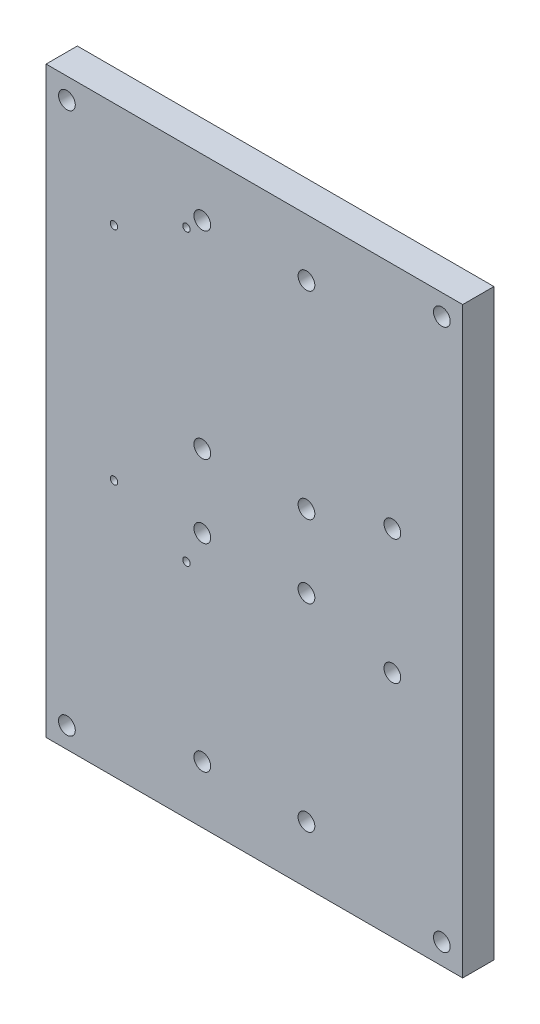
ISO-10303-21;
HEADER;
FILE_DESCRIPTION(('STEP AP214'),'2;1');
FILE_NAME('part.step','',(''),(''),'','','');
FILE_SCHEMA(('AUTOMOTIVE_DESIGN { 1 0 10303 214 1 1 1 1 }'));
ENDSEC;
DATA;
#1=APPLICATION_CONTEXT('core data for automotive mechanical design processes');
#2=APPLICATION_PROTOCOL_DEFINITION('international standard','automotive_design',2000,#1);
#3=PRODUCT_CONTEXT('',#1,'mechanical');
#4=PRODUCT('Part','Part','',(#3));
#5=PRODUCT_RELATED_PRODUCT_CATEGORY('part','',(#4));
#6=PRODUCT_DEFINITION_FORMATION('','',#4);
#7=PRODUCT_DEFINITION_CONTEXT('part definition',#1,'design');
#8=PRODUCT_DEFINITION('design','',#6,#7);
#9=PRODUCT_DEFINITION_SHAPE('','',#8);
#10=(LENGTH_UNIT() NAMED_UNIT(*) SI_UNIT(.MILLI.,.METRE.));
#11=(NAMED_UNIT(*) PLANE_ANGLE_UNIT() SI_UNIT($,.RADIAN.));
#12=(NAMED_UNIT(*) SI_UNIT($,.STERADIAN.) SOLID_ANGLE_UNIT());
#13=UNCERTAINTY_MEASURE_WITH_UNIT(LENGTH_MEASURE(1.E-05),#10,'distance_accuracy_value','');
#14=(GEOMETRIC_REPRESENTATION_CONTEXT(3) GLOBAL_UNCERTAINTY_ASSIGNED_CONTEXT((#13)) GLOBAL_UNIT_ASSIGNED_CONTEXT((#10,
#11,#12)) REPRESENTATION_CONTEXT('',''));
#15=CARTESIAN_POINT('',(0.,0.,0.));
#16=DIRECTION('',(0.,0.,1.));
#17=DIRECTION('',(1.,0.,0.));
#18=AXIS2_PLACEMENT_3D('',#15,#16,#17);
#19=CARTESIAN_POINT('',(0.,0.,4.7625));
#20=DIRECTION('',(0.,0.,1.));
#21=DIRECTION('',(1.,0.,0.));
#22=AXIS2_PLACEMENT_3D('',#19,#20,#21);
#23=PLANE('',#22);
#24=CARTESIAN_POINT('',(-20.701,67.1195,4.7625));
#25=DIRECTION('',(0.,0.,1.));
#26=DIRECTION('',(1.,0.,0.));
#27=AXIS2_PLACEMENT_3D('',#24,#25,#26);
#28=CIRCLE('',#27,1.13029999999999);
#29=CARTESIAN_POINT('',(-19.5707,67.1195,4.7625));
#30=VERTEX_POINT('',#29);
#31=EDGE_CURVE('E228',#30,#30,#28,.T.);
#32=ORIENTED_EDGE('',*,*,#31,.F.);
#33=EDGE_LOOP('',(#32));
#34=FACE_BOUND('',#33,.T.);
#35=CARTESIAN_POINT('',(-42.799,56.7055,4.7625));
#36=DIRECTION('',(0.,0.,1.));
#37=DIRECTION('',(1.,0.,0.));
#38=AXIS2_PLACEMENT_3D('',#35,#36,#37);
#39=CIRCLE('',#38,1.13029999999999);
#40=CARTESIAN_POINT('',(-41.6687,56.7055,4.7625));
#41=VERTEX_POINT('',#40);
#42=EDGE_CURVE('E222',#41,#41,#39,.T.);
#43=ORIENTED_EDGE('',*,*,#42,.F.);
#44=EDGE_LOOP('',(#43));
#45=FACE_BOUND('',#44,.T.);
#46=CARTESIAN_POINT('',(-20.701,-21.082,4.7625));
#47=DIRECTION('',(0.,0.,1.));
#48=DIRECTION('',(1.,0.,0.));
#49=AXIS2_PLACEMENT_3D('',#46,#47,#48);
#50=CIRCLE('',#49,1.13029999999999);
#51=CARTESIAN_POINT('',(-19.5707,-21.082,4.7625));
#52=VERTEX_POINT('',#51);
#53=EDGE_CURVE('E216',#52,#52,#50,.T.);
#54=ORIENTED_EDGE('',*,*,#53,.F.);
#55=EDGE_LOOP('',(#54));
#56=FACE_BOUND('',#55,.T.);
#57=CARTESIAN_POINT('',(-42.799,-10.668,4.7625));
#58=DIRECTION('',(0.,0.,1.));
#59=DIRECTION('',(1.,0.,0.));
#60=AXIS2_PLACEMENT_3D('',#57,#58,#59);
#61=CIRCLE('',#60,1.13029999999999);
#62=CARTESIAN_POINT('',(-41.6687,-10.668,4.7625));
#63=VERTEX_POINT('',#62);
#64=EDGE_CURVE('E210',#63,#63,#61,.T.);
#65=ORIENTED_EDGE('',*,*,#64,.F.);
#66=EDGE_LOOP('',(#65));
#67=FACE_BOUND('',#66,.T.);
#68=CARTESIAN_POINT('',(42.06875,19.05,4.7625));
#69=DIRECTION('',(0.,0.,1.));
#70=DIRECTION('',(1.,0.,0.));
#71=AXIS2_PLACEMENT_3D('',#68,#69,#70);
#72=CIRCLE('',#71,2.55269999999999);
#73=CARTESIAN_POINT('',(44.62145,19.05,4.7625));
#74=VERTEX_POINT('',#73);
#75=EDGE_CURVE('E201',#74,#74,#72,.F.);
#76=ORIENTED_EDGE('',*,*,#75,.T.);
#77=EDGE_LOOP('',(#76));
#78=FACE_BOUND('',#77,.T.);
#79=CARTESIAN_POINT('',(42.06875,-19.05,4.7625));
#80=DIRECTION('',(0.,0.,1.));
#81=DIRECTION('',(1.,0.,0.));
#82=AXIS2_PLACEMENT_3D('',#79,#80,#81);
#83=CIRCLE('',#82,2.55269999999999);
#84=CARTESIAN_POINT('',(44.62145,-19.05,4.7625));
#85=VERTEX_POINT('',#84);
#86=EDGE_CURVE('E195',#85,#85,#83,.F.);
#87=ORIENTED_EDGE('',*,*,#86,.T.);
#88=EDGE_LOOP('',(#87));
#89=FACE_BOUND('',#88,.T.);
#90=CARTESIAN_POINT('',(15.875,71.4375,4.7625));
#91=DIRECTION('',(0.,0.,1.));
#92=DIRECTION('',(1.,0.,0.));
#93=AXIS2_PLACEMENT_3D('',#90,#91,#92);
#94=CIRCLE('',#93,2.5527);
#95=CARTESIAN_POINT('',(18.4277,71.4375,4.7625));
#96=VERTEX_POINT('',#95);
#97=EDGE_CURVE('E189',#96,#96,#94,.F.);
#98=ORIENTED_EDGE('',*,*,#97,.T.);
#99=EDGE_LOOP('',(#98));
#100=FACE_BOUND('',#99,.T.);
#101=CARTESIAN_POINT('',(15.875,11.1125,4.7625));
#102=DIRECTION('',(0.,0.,1.));
#103=DIRECTION('',(1.,0.,0.));
#104=AXIS2_PLACEMENT_3D('',#101,#102,#103);
#105=CIRCLE('',#104,2.5527);
#106=CARTESIAN_POINT('',(18.4277,11.1125,4.7625));
#107=VERTEX_POINT('',#106);
#108=EDGE_CURVE('E177',#107,#107,#105,.F.);
#109=ORIENTED_EDGE('',*,*,#108,.T.);
#110=EDGE_LOOP('',(#109));
#111=FACE_BOUND('',#110,.T.);
#112=CARTESIAN_POINT('',(-15.875,71.4375,4.7625));
#113=DIRECTION('',(0.,0.,1.));
#114=DIRECTION('',(1.,0.,0.));
#115=AXIS2_PLACEMENT_3D('',#112,#113,#114);
#116=CIRCLE('',#115,2.5527);
#117=CARTESIAN_POINT('',(-13.3223,71.4375,4.7625));
#118=VERTEX_POINT('',#117);
#119=EDGE_CURVE('E171',#118,#118,#116,.F.);
#120=ORIENTED_EDGE('',*,*,#119,.T.);
#121=EDGE_LOOP('',(#120));
#122=FACE_BOUND('',#121,.T.);
#123=CARTESIAN_POINT('',(15.875,-11.1125,4.7625));
#124=DIRECTION('',(0.,0.,1.));
#125=DIRECTION('',(1.,0.,0.));
#126=AXIS2_PLACEMENT_3D('',#123,#124,#125);
#127=CIRCLE('',#126,2.5527);
#128=CARTESIAN_POINT('',(18.4277,-11.1125,4.7625));
#129=VERTEX_POINT('',#128);
#130=EDGE_CURVE('E165',#129,#129,#127,.F.);
#131=ORIENTED_EDGE('',*,*,#130,.T.);
#132=EDGE_LOOP('',(#131));
#133=FACE_BOUND('',#132,.T.);
#134=CARTESIAN_POINT('',(-15.875,-71.4375,4.7625));
#135=DIRECTION('',(0.,0.,1.));
#136=DIRECTION('',(1.,0.,0.));
#137=AXIS2_PLACEMENT_3D('',#134,#135,#136);
#138=CIRCLE('',#137,2.5527);
#139=CARTESIAN_POINT('',(-13.3223,-71.4375,4.7625));
#140=VERTEX_POINT('',#139);
#141=EDGE_CURVE('E159',#140,#140,#138,.F.);
#142=ORIENTED_EDGE('',*,*,#141,.T.);
#143=EDGE_LOOP('',(#142));
#144=FACE_BOUND('',#143,.T.);
#145=CARTESIAN_POINT('',(15.875,-71.4375,4.7625));
#146=DIRECTION('',(0.,0.,1.));
#147=DIRECTION('',(1.,0.,0.));
#148=AXIS2_PLACEMENT_3D('',#145,#146,#147);
#149=CIRCLE('',#148,2.5527);
#150=CARTESIAN_POINT('',(18.4277,-71.4375,4.7625));
#151=VERTEX_POINT('',#150);
#152=EDGE_CURVE('E153',#151,#151,#149,.F.);
#153=ORIENTED_EDGE('',*,*,#152,.T.);
#154=EDGE_LOOP('',(#153));
#155=FACE_BOUND('',#154,.T.);
#156=DIRECTION('',(0.,-1.,0.));
#157=VECTOR('',#156,1.);
#158=CARTESIAN_POINT('',(-63.5,88.9,4.7625));
#159=LINE('',#158,#157);
#160=CARTESIAN_POINT('',(-63.5,88.9,4.7625));
#161=VERTEX_POINT('',#160);
#162=CARTESIAN_POINT('',(-63.5,-88.9,4.7625));
#163=VERTEX_POINT('',#162);
#164=EDGE_CURVE('E98',#161,#163,#159,.T.);
#165=ORIENTED_EDGE('',*,*,#164,.T.);
#166=DIRECTION('',(1.,0.,0.));
#167=VECTOR('',#166,1.);
#168=CARTESIAN_POINT('',(-63.5,-88.9,4.7625));
#169=LINE('',#168,#167);
#170=CARTESIAN_POINT('',(63.5,-88.9,4.7625));
#171=VERTEX_POINT('',#170);
#172=EDGE_CURVE('E90',#163,#171,#169,.T.);
#173=ORIENTED_EDGE('',*,*,#172,.T.);
#174=DIRECTION('',(0.,-1.,0.));
#175=VECTOR('',#174,1.);
#176=CARTESIAN_POINT('',(63.5,88.9,4.7625));
#177=LINE('',#176,#175);
#178=CARTESIAN_POINT('',(63.5,88.9,4.7625));
#179=VERTEX_POINT('',#178);
#180=EDGE_CURVE('E97',#179,#171,#177,.T.);
#181=ORIENTED_EDGE('',*,*,#180,.F.);
#182=DIRECTION('',(1.,0.,0.));
#183=VECTOR('',#182,1.);
#184=CARTESIAN_POINT('',(-63.5,88.9,4.7625));
#185=LINE('',#184,#183);
#186=EDGE_CURVE('E107',#161,#179,#185,.T.);
#187=ORIENTED_EDGE('',*,*,#186,.F.);
#188=EDGE_LOOP('',(#165,#173,#181,#187));
#189=FACE_BOUND('',#188,.T.);
#190=CARTESIAN_POINT('',(57.15,-82.55,4.7625));
#191=DIRECTION('',(0.,0.,-1.));
#192=DIRECTION('',(-1.,0.,0.));
#193=AXIS2_PLACEMENT_3D('',#190,#191,#192);
#194=CIRCLE('',#193,2.5527);
#195=CARTESIAN_POINT('',(54.5973,-82.55,4.7625));
#196=VERTEX_POINT('',#195);
#197=EDGE_CURVE('E114',#196,#196,#194,.T.);
#198=ORIENTED_EDGE('',*,*,#197,.T.);
#199=EDGE_LOOP('',(#198));
#200=FACE_BOUND('',#199,.T.);
#201=CARTESIAN_POINT('',(-57.15,-82.55,4.7625));
#202=DIRECTION('',(0.,0.,-1.));
#203=DIRECTION('',(-1.,0.,0.));
#204=AXIS2_PLACEMENT_3D('',#201,#202,#203);
#205=CIRCLE('',#204,2.5527);
#206=CARTESIAN_POINT('',(-59.7027,-82.55,4.7625));
#207=VERTEX_POINT('',#206);
#208=EDGE_CURVE('E129',#207,#207,#205,.T.);
#209=ORIENTED_EDGE('',*,*,#208,.T.);
#210=EDGE_LOOP('',(#209));
#211=FACE_BOUND('',#210,.T.);
#212=CARTESIAN_POINT('',(-57.15,82.55,4.7625));
#213=DIRECTION('',(0.,0.,-1.));
#214=DIRECTION('',(-1.,0.,0.));
#215=AXIS2_PLACEMENT_3D('',#212,#213,#214);
#216=CIRCLE('',#215,2.5527);
#217=CARTESIAN_POINT('',(-59.7027,82.55,4.7625));
#218=VERTEX_POINT('',#217);
#219=EDGE_CURVE('E135',#218,#218,#216,.T.);
#220=ORIENTED_EDGE('',*,*,#219,.T.);
#221=EDGE_LOOP('',(#220));
#222=FACE_BOUND('',#221,.T.);
#223=CARTESIAN_POINT('',(57.15,82.55,4.7625));
#224=DIRECTION('',(0.,0.,-1.));
#225=DIRECTION('',(-1.,0.,0.));
#226=AXIS2_PLACEMENT_3D('',#223,#224,#225);
#227=CIRCLE('',#226,2.5527);
#228=CARTESIAN_POINT('',(54.5973,82.55,4.7625));
#229=VERTEX_POINT('',#228);
#230=EDGE_CURVE('E141',#229,#229,#227,.T.);
#231=ORIENTED_EDGE('',*,*,#230,.T.);
#232=EDGE_LOOP('',(#231));
#233=FACE_BOUND('',#232,.T.);
#234=CARTESIAN_POINT('',(-15.875,-11.1125,4.7625));
#235=DIRECTION('',(0.,0.,1.));
#236=DIRECTION('',(1.,0.,0.));
#237=AXIS2_PLACEMENT_3D('',#234,#235,#236);
#238=CIRCLE('',#237,2.5527);
#239=CARTESIAN_POINT('',(-13.3223,-11.1125,4.7625));
#240=VERTEX_POINT('',#239);
#241=EDGE_CURVE('E147',#240,#240,#238,.F.);
#242=ORIENTED_EDGE('',*,*,#241,.T.);
#243=EDGE_LOOP('',(#242));
#244=FACE_BOUND('',#243,.T.);
#245=CARTESIAN_POINT('',(-15.875,11.1125,4.7625));
#246=DIRECTION('',(0.,0.,1.));
#247=DIRECTION('',(1.,0.,0.));
#248=AXIS2_PLACEMENT_3D('',#245,#246,#247);
#249=CIRCLE('',#248,2.5527);
#250=CARTESIAN_POINT('',(-13.3223,11.1125,4.7625));
#251=VERTEX_POINT('',#250);
#252=EDGE_CURVE('E183',#251,#251,#249,.F.);
#253=ORIENTED_EDGE('',*,*,#252,.T.);
#254=EDGE_LOOP('',(#253));
#255=FACE_BOUND('',#254,.T.);
#256=ADVANCED_FACE('F48',(#34,#45,#56,#67,#78,#89,#100,#111,#122,#133,#144,#155,#189,#200,#211,
#222,#233,#244,#255),#23,.T.);
#257=CARTESIAN_POINT('',(-63.5,88.9,4.7625));
#258=DIRECTION('',(1.,0.,0.));
#259=DIRECTION('',(0.,1.,0.));
#260=AXIS2_PLACEMENT_3D('',#257,#258,#259);
#261=PLANE('',#260);
#262=DIRECTION('',(0.,-1.,0.));
#263=VECTOR('',#262,1.);
#264=CARTESIAN_POINT('',(-63.5,88.9,-4.7625));
#265=LINE('',#264,#263);
#266=CARTESIAN_POINT('',(-63.5,88.9,-4.7625));
#267=VERTEX_POINT('',#266);
#268=CARTESIAN_POINT('',(-63.5,-88.9,-4.7625));
#269=VERTEX_POINT('',#268);
#270=EDGE_CURVE('E112',#267,#269,#265,.T.);
#271=ORIENTED_EDGE('',*,*,#270,.T.);
#272=DIRECTION('',(0.,0.,-1.));
#273=VECTOR('',#272,1.);
#274=CARTESIAN_POINT('',(-63.5,-88.9,4.7625));
#275=LINE('',#274,#273);
#276=EDGE_CURVE('E13',#163,#269,#275,.T.);
#277=ORIENTED_EDGE('',*,*,#276,.F.);
#278=ORIENTED_EDGE('',*,*,#164,.F.);
#279=DIRECTION('',(0.,0.,-1.));
#280=VECTOR('',#279,1.);
#281=CARTESIAN_POINT('',(-63.5,88.9,4.7625));
#282=LINE('',#281,#280);
#283=EDGE_CURVE('E65',#161,#267,#282,.T.);
#284=ORIENTED_EDGE('',*,*,#283,.T.);
#285=EDGE_LOOP('',(#271,#277,#278,#284));
#286=FACE_BOUND('',#285,.T.);
#287=ADVANCED_FACE('F50',(#286),#261,.F.);
#288=CARTESIAN_POINT('',(-63.5,-88.9,4.7625));
#289=DIRECTION('',(0.,1.,0.));
#290=DIRECTION('',(0.,0.,1.));
#291=AXIS2_PLACEMENT_3D('',#288,#289,#290);
#292=PLANE('',#291);
#293=DIRECTION('',(1.,0.,0.));
#294=VECTOR('',#293,1.);
#295=CARTESIAN_POINT('',(-63.5,-88.9,-4.7625));
#296=LINE('',#295,#294);
#297=CARTESIAN_POINT('',(63.5,-88.9,-4.7625));
#298=VERTEX_POINT('',#297);
#299=EDGE_CURVE('E103',#269,#298,#296,.T.);
#300=ORIENTED_EDGE('',*,*,#299,.T.);
#301=DIRECTION('',(0.,0.,-1.));
#302=VECTOR('',#301,1.);
#303=CARTESIAN_POINT('',(63.5,-88.9,4.7625));
#304=LINE('',#303,#302);
#305=EDGE_CURVE('E57',#171,#298,#304,.T.);
#306=ORIENTED_EDGE('',*,*,#305,.F.);
#307=ORIENTED_EDGE('',*,*,#172,.F.);
#308=ORIENTED_EDGE('',*,*,#276,.T.);
#309=EDGE_LOOP('',(#300,#306,#307,#308));
#310=FACE_BOUND('',#309,.T.);
#311=ADVANCED_FACE('F102',(#310),#292,.F.);
#312=CARTESIAN_POINT('',(63.5,88.9,4.7625));
#313=DIRECTION('',(1.,0.,0.));
#314=DIRECTION('',(0.,1.,0.));
#315=AXIS2_PLACEMENT_3D('',#312,#313,#314);
#316=PLANE('',#315);
#317=DIRECTION('',(0.,-1.,0.));
#318=VECTOR('',#317,1.);
#319=CARTESIAN_POINT('',(63.5,88.9,-4.7625));
#320=LINE('',#319,#318);
#321=CARTESIAN_POINT('',(63.5,88.9,-4.7625));
#322=VERTEX_POINT('',#321);
#323=EDGE_CURVE('E116',#322,#298,#320,.T.);
#324=ORIENTED_EDGE('',*,*,#323,.F.);
#325=DIRECTION('',(0.,0.,-1.));
#326=VECTOR('',#325,1.);
#327=CARTESIAN_POINT('',(63.5,88.9,4.7625));
#328=LINE('',#327,#326);
#329=EDGE_CURVE('E79',#179,#322,#328,.T.);
#330=ORIENTED_EDGE('',*,*,#329,.F.);
#331=ORIENTED_EDGE('',*,*,#180,.T.);
#332=ORIENTED_EDGE('',*,*,#305,.T.);
#333=EDGE_LOOP('',(#324,#330,#331,#332));
#334=FACE_BOUND('',#333,.T.);
#335=ADVANCED_FACE('F106',(#334),#316,.T.);
#336=CARTESIAN_POINT('',(-63.5,88.9,4.7625));
#337=DIRECTION('',(0.,1.,0.));
#338=DIRECTION('',(0.,0.,1.));
#339=AXIS2_PLACEMENT_3D('',#336,#337,#338);
#340=PLANE('',#339);
#341=DIRECTION('',(1.,0.,0.));
#342=VECTOR('',#341,1.);
#343=CARTESIAN_POINT('',(-63.5,88.9,-4.7625));
#344=LINE('',#343,#342);
#345=EDGE_CURVE('E118',#267,#322,#344,.T.);
#346=ORIENTED_EDGE('',*,*,#345,.F.);
#347=ORIENTED_EDGE('',*,*,#283,.F.);
#348=ORIENTED_EDGE('',*,*,#186,.T.);
#349=ORIENTED_EDGE('',*,*,#329,.T.);
#350=EDGE_LOOP('',(#346,#347,#348,#349));
#351=FACE_BOUND('',#350,.T.);
#352=ADVANCED_FACE('F271',(#351),#340,.T.);
#353=CARTESIAN_POINT('',(0.,0.,-4.7625));
#354=DIRECTION('',(0.,0.,1.));
#355=DIRECTION('',(1.,0.,0.));
#356=AXIS2_PLACEMENT_3D('',#353,#354,#355);
#357=PLANE('',#356);
#358=CARTESIAN_POINT('',(-20.701,67.1195,-4.7625));
#359=DIRECTION('',(0.,0.,1.));
#360=DIRECTION('',(1.,0.,0.));
#361=AXIS2_PLACEMENT_3D('',#358,#359,#360);
#362=CIRCLE('',#361,1.1303);
#363=CARTESIAN_POINT('',(-19.5707,67.1195,-4.7625));
#364=VERTEX_POINT('',#363);
#365=EDGE_CURVE('E225',#364,#364,#362,.T.);
#366=ORIENTED_EDGE('',*,*,#365,.T.);
#367=EDGE_LOOP('',(#366));
#368=FACE_BOUND('',#367,.T.);
#369=CARTESIAN_POINT('',(-42.799,56.7055,-4.7625));
#370=DIRECTION('',(0.,0.,1.));
#371=DIRECTION('',(1.,0.,0.));
#372=AXIS2_PLACEMENT_3D('',#369,#370,#371);
#373=CIRCLE('',#372,1.1303);
#374=CARTESIAN_POINT('',(-41.6687,56.7055,-4.7625));
#375=VERTEX_POINT('',#374);
#376=EDGE_CURVE('E219',#375,#375,#373,.T.);
#377=ORIENTED_EDGE('',*,*,#376,.T.);
#378=EDGE_LOOP('',(#377));
#379=FACE_BOUND('',#378,.T.);
#380=CARTESIAN_POINT('',(-20.701,-21.082,-4.7625));
#381=DIRECTION('',(0.,0.,1.));
#382=DIRECTION('',(1.,0.,0.));
#383=AXIS2_PLACEMENT_3D('',#380,#381,#382);
#384=CIRCLE('',#383,1.1303);
#385=CARTESIAN_POINT('',(-19.5707,-21.082,-4.7625));
#386=VERTEX_POINT('',#385);
#387=EDGE_CURVE('E213',#386,#386,#384,.T.);
#388=ORIENTED_EDGE('',*,*,#387,.T.);
#389=EDGE_LOOP('',(#388));
#390=FACE_BOUND('',#389,.T.);
#391=CARTESIAN_POINT('',(-42.799,-10.668,-4.7625));
#392=DIRECTION('',(0.,0.,1.));
#393=DIRECTION('',(1.,0.,0.));
#394=AXIS2_PLACEMENT_3D('',#391,#392,#393);
#395=CIRCLE('',#394,1.1303);
#396=CARTESIAN_POINT('',(-41.6687,-10.668,-4.7625));
#397=VERTEX_POINT('',#396);
#398=EDGE_CURVE('E207',#397,#397,#395,.T.);
#399=ORIENTED_EDGE('',*,*,#398,.T.);
#400=EDGE_LOOP('',(#399));
#401=FACE_BOUND('',#400,.T.);
#402=CARTESIAN_POINT('',(42.06875,19.05,-4.7625));
#403=DIRECTION('',(0.,0.,-1.));
#404=DIRECTION('',(-1.,0.,0.));
#405=AXIS2_PLACEMENT_3D('',#402,#403,#404);
#406=CIRCLE('',#405,2.55269999999999);
#407=CARTESIAN_POINT('',(39.51605,19.05,-4.7625));
#408=VERTEX_POINT('',#407);
#409=EDGE_CURVE('E204',#408,#408,#406,.T.);
#410=ORIENTED_EDGE('',*,*,#409,.F.);
#411=EDGE_LOOP('',(#410));
#412=FACE_BOUND('',#411,.T.);
#413=CARTESIAN_POINT('',(42.06875,-19.05,-4.7625));
#414=DIRECTION('',(0.,0.,-1.));
#415=DIRECTION('',(-1.,0.,0.));
#416=AXIS2_PLACEMENT_3D('',#413,#414,#415);
#417=CIRCLE('',#416,2.55269999999999);
#418=CARTESIAN_POINT('',(39.51605,-19.05,-4.7625));
#419=VERTEX_POINT('',#418);
#420=EDGE_CURVE('E198',#419,#419,#417,.T.);
#421=ORIENTED_EDGE('',*,*,#420,.F.);
#422=EDGE_LOOP('',(#421));
#423=FACE_BOUND('',#422,.T.);
#424=CARTESIAN_POINT('',(15.875,71.4375,-4.7625));
#425=DIRECTION('',(0.,0.,-1.));
#426=DIRECTION('',(-1.,0.,0.));
#427=AXIS2_PLACEMENT_3D('',#424,#425,#426);
#428=CIRCLE('',#427,2.5527);
#429=CARTESIAN_POINT('',(13.3223,71.4375,-4.7625));
#430=VERTEX_POINT('',#429);
#431=EDGE_CURVE('E192',#430,#430,#428,.T.);
#432=ORIENTED_EDGE('',*,*,#431,.F.);
#433=EDGE_LOOP('',(#432));
#434=FACE_BOUND('',#433,.T.);
#435=CARTESIAN_POINT('',(-15.875,11.1125,-4.7625));
#436=DIRECTION('',(0.,0.,-1.));
#437=DIRECTION('',(-1.,0.,0.));
#438=AXIS2_PLACEMENT_3D('',#435,#436,#437);
#439=CIRCLE('',#438,2.5527);
#440=CARTESIAN_POINT('',(-18.4277,11.1125,-4.7625));
#441=VERTEX_POINT('',#440);
#442=EDGE_CURVE('E186',#441,#441,#439,.T.);
#443=ORIENTED_EDGE('',*,*,#442,.F.);
#444=EDGE_LOOP('',(#443));
#445=FACE_BOUND('',#444,.T.);
#446=CARTESIAN_POINT('',(15.875,11.1125,-4.7625));
#447=DIRECTION('',(0.,0.,-1.));
#448=DIRECTION('',(-1.,0.,0.));
#449=AXIS2_PLACEMENT_3D('',#446,#447,#448);
#450=CIRCLE('',#449,2.5527);
#451=CARTESIAN_POINT('',(13.3223,11.1125,-4.7625));
#452=VERTEX_POINT('',#451);
#453=EDGE_CURVE('E180',#452,#452,#450,.T.);
#454=ORIENTED_EDGE('',*,*,#453,.F.);
#455=EDGE_LOOP('',(#454));
#456=FACE_BOUND('',#455,.T.);
#457=CARTESIAN_POINT('',(-15.875,71.4375,-4.7625));
#458=DIRECTION('',(0.,0.,-1.));
#459=DIRECTION('',(-1.,0.,0.));
#460=AXIS2_PLACEMENT_3D('',#457,#458,#459);
#461=CIRCLE('',#460,2.5527);
#462=CARTESIAN_POINT('',(-18.4277,71.4375,-4.7625));
#463=VERTEX_POINT('',#462);
#464=EDGE_CURVE('E174',#463,#463,#461,.T.);
#465=ORIENTED_EDGE('',*,*,#464,.F.);
#466=EDGE_LOOP('',(#465));
#467=FACE_BOUND('',#466,.T.);
#468=CARTESIAN_POINT('',(15.875,-11.1125,-4.7625));
#469=DIRECTION('',(0.,0.,-1.));
#470=DIRECTION('',(-1.,0.,0.));
#471=AXIS2_PLACEMENT_3D('',#468,#469,#470);
#472=CIRCLE('',#471,2.5527);
#473=CARTESIAN_POINT('',(13.3223,-11.1125,-4.7625));
#474=VERTEX_POINT('',#473);
#475=EDGE_CURVE('E168',#474,#474,#472,.T.);
#476=ORIENTED_EDGE('',*,*,#475,.F.);
#477=EDGE_LOOP('',(#476));
#478=FACE_BOUND('',#477,.T.);
#479=CARTESIAN_POINT('',(-15.875,-71.4375,-4.7625));
#480=DIRECTION('',(0.,0.,-1.));
#481=DIRECTION('',(-1.,0.,0.));
#482=AXIS2_PLACEMENT_3D('',#479,#480,#481);
#483=CIRCLE('',#482,2.5527);
#484=CARTESIAN_POINT('',(-18.4277,-71.4375,-4.7625));
#485=VERTEX_POINT('',#484);
#486=EDGE_CURVE('E162',#485,#485,#483,.T.);
#487=ORIENTED_EDGE('',*,*,#486,.F.);
#488=EDGE_LOOP('',(#487));
#489=FACE_BOUND('',#488,.T.);
#490=CARTESIAN_POINT('',(15.875,-71.4375,-4.7625));
#491=DIRECTION('',(0.,0.,-1.));
#492=DIRECTION('',(-1.,0.,0.));
#493=AXIS2_PLACEMENT_3D('',#490,#491,#492);
#494=CIRCLE('',#493,2.5527);
#495=CARTESIAN_POINT('',(13.3223,-71.4375,-4.7625));
#496=VERTEX_POINT('',#495);
#497=EDGE_CURVE('E156',#496,#496,#494,.T.);
#498=ORIENTED_EDGE('',*,*,#497,.F.);
#499=EDGE_LOOP('',(#498));
#500=FACE_BOUND('',#499,.T.);
#501=CARTESIAN_POINT('',(-15.875,-11.1125,-4.7625));
#502=DIRECTION('',(0.,0.,-1.));
#503=DIRECTION('',(-1.,0.,0.));
#504=AXIS2_PLACEMENT_3D('',#501,#502,#503);
#505=CIRCLE('',#504,2.5527);
#506=CARTESIAN_POINT('',(-18.4277,-11.1125,-4.7625));
#507=VERTEX_POINT('',#506);
#508=EDGE_CURVE('E150',#507,#507,#505,.T.);
#509=ORIENTED_EDGE('',*,*,#508,.F.);
#510=EDGE_LOOP('',(#509));
#511=FACE_BOUND('',#510,.T.);
#512=CARTESIAN_POINT('',(57.15,82.55,-4.7625));
#513=DIRECTION('',(0.,0.,-1.));
#514=DIRECTION('',(-1.,0.,0.));
#515=AXIS2_PLACEMENT_3D('',#512,#513,#514);
#516=CIRCLE('',#515,2.55269999999998);
#517=CARTESIAN_POINT('',(54.5973,82.55,-4.7625));
#518=VERTEX_POINT('',#517);
#519=EDGE_CURVE('E144',#518,#518,#516,.T.);
#520=ORIENTED_EDGE('',*,*,#519,.F.);
#521=EDGE_LOOP('',(#520));
#522=FACE_BOUND('',#521,.T.);
#523=CARTESIAN_POINT('',(-57.15,82.55,-4.7625));
#524=DIRECTION('',(0.,0.,-1.));
#525=DIRECTION('',(-1.,0.,0.));
#526=AXIS2_PLACEMENT_3D('',#523,#524,#525);
#527=CIRCLE('',#526,2.55269999999999);
#528=CARTESIAN_POINT('',(-59.7027,82.55,-4.7625));
#529=VERTEX_POINT('',#528);
#530=EDGE_CURVE('E138',#529,#529,#527,.T.);
#531=ORIENTED_EDGE('',*,*,#530,.F.);
#532=EDGE_LOOP('',(#531));
#533=FACE_BOUND('',#532,.T.);
#534=CARTESIAN_POINT('',(-57.15,-82.55,-4.7625));
#535=DIRECTION('',(0.,0.,-1.));
#536=DIRECTION('',(-1.,0.,0.));
#537=AXIS2_PLACEMENT_3D('',#534,#535,#536);
#538=CIRCLE('',#537,2.55269999999999);
#539=CARTESIAN_POINT('',(-59.7027,-82.55,-4.7625));
#540=VERTEX_POINT('',#539);
#541=EDGE_CURVE('E132',#540,#540,#538,.T.);
#542=ORIENTED_EDGE('',*,*,#541,.F.);
#543=EDGE_LOOP('',(#542));
#544=FACE_BOUND('',#543,.T.);
#545=CARTESIAN_POINT('',(57.15,-82.55,-4.7625));
#546=DIRECTION('',(0.,0.,-1.));
#547=DIRECTION('',(-1.,0.,0.));
#548=AXIS2_PLACEMENT_3D('',#545,#546,#547);
#549=CIRCLE('',#548,2.55269999999998);
#550=CARTESIAN_POINT('',(54.5973,-82.55,-4.7625));
#551=VERTEX_POINT('',#550);
#552=EDGE_CURVE('E126',#551,#551,#549,.T.);
#553=ORIENTED_EDGE('',*,*,#552,.F.);
#554=EDGE_LOOP('',(#553));
#555=FACE_BOUND('',#554,.T.);
#556=ORIENTED_EDGE('',*,*,#270,.F.);
#557=ORIENTED_EDGE('',*,*,#345,.T.);
#558=ORIENTED_EDGE('',*,*,#323,.T.);
#559=ORIENTED_EDGE('',*,*,#299,.F.);
#560=EDGE_LOOP('',(#556,#557,#558,#559));
#561=FACE_BOUND('',#560,.T.);
#562=ADVANCED_FACE('F267',(#368,#379,#390,#401,#412,#423,#434,#445,#456,#467,#478,#489,#500,
#511,#522,#533,#544,#555,#561),#357,.F.);
#563=CARTESIAN_POINT('',(57.15,-82.55,-4.7625));
#564=DIRECTION('',(0.,0.,-1.));
#565=DIRECTION('',(-1.,0.,0.));
#566=AXIS2_PLACEMENT_3D('',#563,#564,#565);
#567=CYLINDRICAL_SURFACE('',#566,2.55269999999999);
#568=ORIENTED_EDGE('',*,*,#197,.F.);
#569=EDGE_LOOP('',(#568));
#570=FACE_BOUND('',#569,.T.);
#571=ORIENTED_EDGE('',*,*,#552,.T.);
#572=EDGE_LOOP('',(#571));
#573=FACE_BOUND('',#572,.T.);
#574=ADVANCED_FACE('F270',(#570,#573),#567,.F.);
#575=CARTESIAN_POINT('',(-57.15,-82.55,-4.7625));
#576=DIRECTION('',(0.,0.,-1.));
#577=DIRECTION('',(-1.,0.,0.));
#578=AXIS2_PLACEMENT_3D('',#575,#576,#577);
#579=CYLINDRICAL_SURFACE('',#578,2.55269999999999);
#580=ORIENTED_EDGE('',*,*,#208,.F.);
#581=EDGE_LOOP('',(#580));
#582=FACE_BOUND('',#581,.T.);
#583=ORIENTED_EDGE('',*,*,#541,.T.);
#584=EDGE_LOOP('',(#583));
#585=FACE_BOUND('',#584,.T.);
#586=ADVANCED_FACE('F401',(#582,#585),#579,.F.);
#587=CARTESIAN_POINT('',(-57.15,82.55,-4.7625));
#588=DIRECTION('',(0.,0.,-1.));
#589=DIRECTION('',(-1.,0.,0.));
#590=AXIS2_PLACEMENT_3D('',#587,#588,#589);
#591=CYLINDRICAL_SURFACE('',#590,2.55269999999999);
#592=ORIENTED_EDGE('',*,*,#219,.F.);
#593=EDGE_LOOP('',(#592));
#594=FACE_BOUND('',#593,.T.);
#595=ORIENTED_EDGE('',*,*,#530,.T.);
#596=EDGE_LOOP('',(#595));
#597=FACE_BOUND('',#596,.T.);
#598=ADVANCED_FACE('F397',(#594,#597),#591,.F.);
#599=CARTESIAN_POINT('',(57.15,82.55,-4.7625));
#600=DIRECTION('',(0.,0.,-1.));
#601=DIRECTION('',(-1.,0.,0.));
#602=AXIS2_PLACEMENT_3D('',#599,#600,#601);
#603=CYLINDRICAL_SURFACE('',#602,2.55269999999999);
#604=ORIENTED_EDGE('',*,*,#230,.F.);
#605=EDGE_LOOP('',(#604));
#606=FACE_BOUND('',#605,.T.);
#607=ORIENTED_EDGE('',*,*,#519,.T.);
#608=EDGE_LOOP('',(#607));
#609=FACE_BOUND('',#608,.T.);
#610=ADVANCED_FACE('F393',(#606,#609),#603,.F.);
#611=CARTESIAN_POINT('',(-15.875,-11.1125,-4.7625));
#612=DIRECTION('',(0.,0.,-1.));
#613=DIRECTION('',(-1.,0.,0.));
#614=AXIS2_PLACEMENT_3D('',#611,#612,#613);
#615=CYLINDRICAL_SURFACE('',#614,2.5527);
#616=ORIENTED_EDGE('',*,*,#241,.F.);
#617=EDGE_LOOP('',(#616));
#618=FACE_BOUND('',#617,.T.);
#619=ORIENTED_EDGE('',*,*,#508,.T.);
#620=EDGE_LOOP('',(#619));
#621=FACE_BOUND('',#620,.T.);
#622=ADVANCED_FACE('F263',(#618,#621),#615,.F.);
#623=CARTESIAN_POINT('',(15.875,-71.4375,-4.7625));
#624=DIRECTION('',(0.,0.,-1.));
#625=DIRECTION('',(-1.,0.,0.));
#626=AXIS2_PLACEMENT_3D('',#623,#624,#625);
#627=CYLINDRICAL_SURFACE('',#626,2.5527);
#628=ORIENTED_EDGE('',*,*,#152,.F.);
#629=EDGE_LOOP('',(#628));
#630=FACE_BOUND('',#629,.T.);
#631=ORIENTED_EDGE('',*,*,#497,.T.);
#632=EDGE_LOOP('',(#631));
#633=FACE_BOUND('',#632,.T.);
#634=ADVANCED_FACE('F259',(#630,#633),#627,.F.);
#635=CARTESIAN_POINT('',(-15.875,-71.4375,-4.7625));
#636=DIRECTION('',(0.,0.,-1.));
#637=DIRECTION('',(-1.,0.,0.));
#638=AXIS2_PLACEMENT_3D('',#635,#636,#637);
#639=CYLINDRICAL_SURFACE('',#638,2.5527);
#640=ORIENTED_EDGE('',*,*,#141,.F.);
#641=EDGE_LOOP('',(#640));
#642=FACE_BOUND('',#641,.T.);
#643=ORIENTED_EDGE('',*,*,#486,.T.);
#644=EDGE_LOOP('',(#643));
#645=FACE_BOUND('',#644,.T.);
#646=ADVANCED_FACE('F262',(#642,#645),#639,.F.);
#647=CARTESIAN_POINT('',(15.875,-11.1125,-4.7625));
#648=DIRECTION('',(0.,0.,-1.));
#649=DIRECTION('',(-1.,0.,0.));
#650=AXIS2_PLACEMENT_3D('',#647,#648,#649);
#651=CYLINDRICAL_SURFACE('',#650,2.5527);
#652=ORIENTED_EDGE('',*,*,#130,.F.);
#653=EDGE_LOOP('',(#652));
#654=FACE_BOUND('',#653,.T.);
#655=ORIENTED_EDGE('',*,*,#475,.T.);
#656=EDGE_LOOP('',(#655));
#657=FACE_BOUND('',#656,.T.);
#658=ADVANCED_FACE('F383',(#654,#657),#651,.F.);
#659=CARTESIAN_POINT('',(-15.875,71.4375,-4.7625));
#660=DIRECTION('',(0.,0.,-1.));
#661=DIRECTION('',(-1.,0.,0.));
#662=AXIS2_PLACEMENT_3D('',#659,#660,#661);
#663=CYLINDRICAL_SURFACE('',#662,2.5527);
#664=ORIENTED_EDGE('',*,*,#119,.F.);
#665=EDGE_LOOP('',(#664));
#666=FACE_BOUND('',#665,.T.);
#667=ORIENTED_EDGE('',*,*,#464,.T.);
#668=EDGE_LOOP('',(#667));
#669=FACE_BOUND('',#668,.T.);
#670=ADVANCED_FACE('F379',(#666,#669),#663,.F.);
#671=CARTESIAN_POINT('',(15.875,11.1125,-4.7625));
#672=DIRECTION('',(0.,0.,-1.));
#673=DIRECTION('',(-1.,0.,0.));
#674=AXIS2_PLACEMENT_3D('',#671,#672,#673);
#675=CYLINDRICAL_SURFACE('',#674,2.5527);
#676=ORIENTED_EDGE('',*,*,#108,.F.);
#677=EDGE_LOOP('',(#676));
#678=FACE_BOUND('',#677,.T.);
#679=ORIENTED_EDGE('',*,*,#453,.T.);
#680=EDGE_LOOP('',(#679));
#681=FACE_BOUND('',#680,.T.);
#682=ADVANCED_FACE('F375',(#678,#681),#675,.F.);
#683=CARTESIAN_POINT('',(-15.875,11.1125,-4.7625));
#684=DIRECTION('',(0.,0.,-1.));
#685=DIRECTION('',(-1.,0.,0.));
#686=AXIS2_PLACEMENT_3D('',#683,#684,#685);
#687=CYLINDRICAL_SURFACE('',#686,2.5527);
#688=ORIENTED_EDGE('',*,*,#252,.F.);
#689=EDGE_LOOP('',(#688));
#690=FACE_BOUND('',#689,.T.);
#691=ORIENTED_EDGE('',*,*,#442,.T.);
#692=EDGE_LOOP('',(#691));
#693=FACE_BOUND('',#692,.T.);
#694=ADVANCED_FACE('F371',(#690,#693),#687,.F.);
#695=CARTESIAN_POINT('',(15.875,71.4375,-4.7625));
#696=DIRECTION('',(0.,0.,-1.));
#697=DIRECTION('',(-1.,0.,0.));
#698=AXIS2_PLACEMENT_3D('',#695,#696,#697);
#699=CYLINDRICAL_SURFACE('',#698,2.5527);
#700=ORIENTED_EDGE('',*,*,#97,.F.);
#701=EDGE_LOOP('',(#700));
#702=FACE_BOUND('',#701,.T.);
#703=ORIENTED_EDGE('',*,*,#431,.T.);
#704=EDGE_LOOP('',(#703));
#705=FACE_BOUND('',#704,.T.);
#706=ADVANCED_FACE('F367',(#702,#705),#699,.F.);
#707=CARTESIAN_POINT('',(42.06875,-19.05,-4.7625));
#708=DIRECTION('',(0.,0.,-1.));
#709=DIRECTION('',(-1.,0.,0.));
#710=AXIS2_PLACEMENT_3D('',#707,#708,#709);
#711=CYLINDRICAL_SURFACE('',#710,2.55269999999999);
#712=ORIENTED_EDGE('',*,*,#86,.F.);
#713=EDGE_LOOP('',(#712));
#714=FACE_BOUND('',#713,.T.);
#715=ORIENTED_EDGE('',*,*,#420,.T.);
#716=EDGE_LOOP('',(#715));
#717=FACE_BOUND('',#716,.T.);
#718=ADVANCED_FACE('F363',(#714,#717),#711,.F.);
#719=CARTESIAN_POINT('',(42.06875,19.05,-4.7625));
#720=DIRECTION('',(0.,0.,-1.));
#721=DIRECTION('',(-1.,0.,0.));
#722=AXIS2_PLACEMENT_3D('',#719,#720,#721);
#723=CYLINDRICAL_SURFACE('',#722,2.55269999999999);
#724=ORIENTED_EDGE('',*,*,#75,.F.);
#725=EDGE_LOOP('',(#724));
#726=FACE_BOUND('',#725,.T.);
#727=ORIENTED_EDGE('',*,*,#409,.T.);
#728=EDGE_LOOP('',(#727));
#729=FACE_BOUND('',#728,.T.);
#730=ADVANCED_FACE('F307',(#726,#729),#723,.F.);
#731=CARTESIAN_POINT('',(-42.799,-10.668,4.7625));
#732=DIRECTION('',(0.,0.,1.));
#733=DIRECTION('',(1.,0.,0.));
#734=AXIS2_PLACEMENT_3D('',#731,#732,#733);
#735=CYLINDRICAL_SURFACE('',#734,1.13029999999999);
#736=ORIENTED_EDGE('',*,*,#398,.F.);
#737=EDGE_LOOP('',(#736));
#738=FACE_BOUND('',#737,.T.);
#739=ORIENTED_EDGE('',*,*,#64,.T.);
#740=EDGE_LOOP('',(#739));
#741=FACE_BOUND('',#740,.T.);
#742=ADVANCED_FACE('F321',(#738,#741),#735,.F.);
#743=CARTESIAN_POINT('',(-20.701,-21.082,4.7625));
#744=DIRECTION('',(0.,0.,1.));
#745=DIRECTION('',(1.,0.,0.));
#746=AXIS2_PLACEMENT_3D('',#743,#744,#745);
#747=CYLINDRICAL_SURFACE('',#746,1.13029999999999);
#748=ORIENTED_EDGE('',*,*,#387,.F.);
#749=EDGE_LOOP('',(#748));
#750=FACE_BOUND('',#749,.T.);
#751=ORIENTED_EDGE('',*,*,#53,.T.);
#752=EDGE_LOOP('',(#751));
#753=FACE_BOUND('',#752,.T.);
#754=ADVANCED_FACE('F326',(#750,#753),#747,.F.);
#755=CARTESIAN_POINT('',(-42.799,56.7055,4.7625));
#756=DIRECTION('',(0.,0.,1.));
#757=DIRECTION('',(1.,0.,0.));
#758=AXIS2_PLACEMENT_3D('',#755,#756,#757);
#759=CYLINDRICAL_SURFACE('',#758,1.13029999999999);
#760=ORIENTED_EDGE('',*,*,#376,.F.);
#761=EDGE_LOOP('',(#760));
#762=FACE_BOUND('',#761,.T.);
#763=ORIENTED_EDGE('',*,*,#42,.T.);
#764=EDGE_LOOP('',(#763));
#765=FACE_BOUND('',#764,.T.);
#766=ADVANCED_FACE('F337',(#762,#765),#759,.F.);
#767=CARTESIAN_POINT('',(-20.701,67.1195,4.7625));
#768=DIRECTION('',(0.,0.,1.));
#769=DIRECTION('',(1.,0.,0.));
#770=AXIS2_PLACEMENT_3D('',#767,#768,#769);
#771=CYLINDRICAL_SURFACE('',#770,1.13029999999999);
#772=ORIENTED_EDGE('',*,*,#365,.F.);
#773=EDGE_LOOP('',(#772));
#774=FACE_BOUND('',#773,.T.);
#775=ORIENTED_EDGE('',*,*,#31,.T.);
#776=EDGE_LOOP('',(#775));
#777=FACE_BOUND('',#776,.T.);
#778=ADVANCED_FACE('F232',(#774,#777),#771,.F.);
#779=CLOSED_SHELL('',(#256,#287,#311,#335,#352,#562,#574,#586,#598,#610,#622,#634,#646,#658,
#670,#682,#694,#706,#718,#730,#742,#754,#766,#778));
#780=MANIFOLD_SOLID_BREP('B2',#779);
#781=ADVANCED_BREP_SHAPE_REPRESENTATION('',(#18,#780),#14);
#782=SHAPE_DEFINITION_REPRESENTATION(#9,#781);
ENDSEC;
END-ISO-10303-21;
